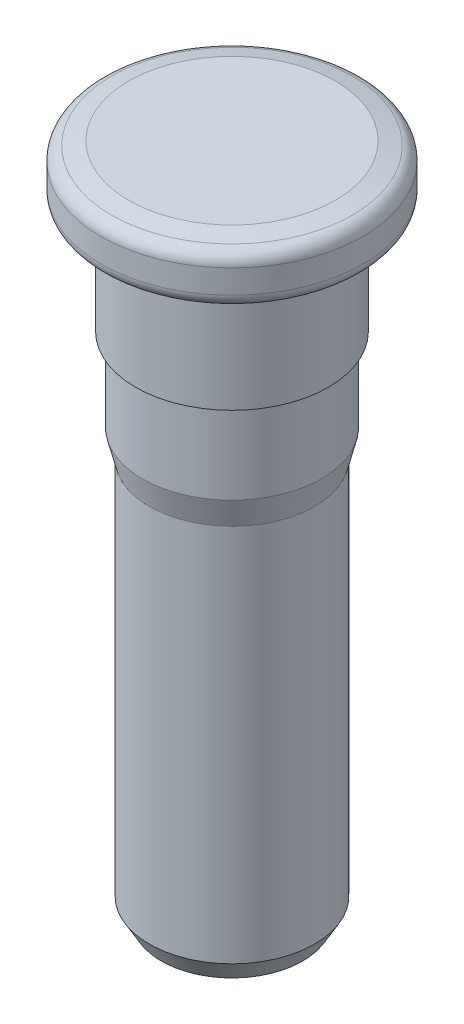
ISO-10303-21;
HEADER;
FILE_DESCRIPTION(('STEP AP214'),'2;1');
FILE_NAME('part.step','',(''),(''),'','','');
FILE_SCHEMA(('AUTOMOTIVE_DESIGN { 1 0 10303 214 1 1 1 1 }'));
ENDSEC;
DATA;
#1=APPLICATION_CONTEXT('core data for automotive mechanical design processes');
#2=APPLICATION_PROTOCOL_DEFINITION('international standard','automotive_design',2000,#1);
#3=PRODUCT_CONTEXT('',#1,'mechanical');
#4=PRODUCT('Part','Part','',(#3));
#5=PRODUCT_RELATED_PRODUCT_CATEGORY('part','',(#4));
#6=PRODUCT_DEFINITION_FORMATION('','',#4);
#7=PRODUCT_DEFINITION_CONTEXT('part definition',#1,'design');
#8=PRODUCT_DEFINITION('design','',#6,#7);
#9=PRODUCT_DEFINITION_SHAPE('','',#8);
#10=(LENGTH_UNIT() NAMED_UNIT(*) SI_UNIT(.MILLI.,.METRE.));
#11=(NAMED_UNIT(*) PLANE_ANGLE_UNIT() SI_UNIT($,.RADIAN.));
#12=(NAMED_UNIT(*) SI_UNIT($,.STERADIAN.) SOLID_ANGLE_UNIT());
#13=UNCERTAINTY_MEASURE_WITH_UNIT(LENGTH_MEASURE(1.E-05),#10,'distance_accuracy_value','');
#14=(GEOMETRIC_REPRESENTATION_CONTEXT(3) GLOBAL_UNCERTAINTY_ASSIGNED_CONTEXT((#13)) GLOBAL_UNIT_ASSIGNED_CONTEXT((#10,
#11,#12)) REPRESENTATION_CONTEXT('',''));
#15=CARTESIAN_POINT('',(0.,0.,0.));
#16=DIRECTION('',(0.,0.,1.));
#17=DIRECTION('',(1.,0.,0.));
#18=AXIS2_PLACEMENT_3D('',#15,#16,#17);
#19=CARTESIAN_POINT('',(0.,44.3370297371885,0.));
#20=DIRECTION('',(0.,1.,0.));
#21=DIRECTION('',(0.,0.,1.));
#22=AXIS2_PLACEMENT_3D('',#19,#20,#21);
#23=PLANE('',#22);
#24=CARTESIAN_POINT('',(0.,44.3370297371885,0.));
#25=DIRECTION('',(0.,-1.,0.));
#26=DIRECTION('',(0.,0.,-1.));
#27=AXIS2_PLACEMENT_3D('',#24,#25,#26);
#28=CIRCLE('',#27,7.5);
#29=CARTESIAN_POINT('',(0.,44.3370297371885,-7.5));
#30=VERTEX_POINT('',#29);
#31=EDGE_CURVE('E56',#30,#30,#28,.T.);
#32=ORIENTED_EDGE('',*,*,#31,.F.);
#33=EDGE_LOOP('',(#32));
#34=FACE_BOUND('',#33,.T.);
#35=ADVANCED_FACE('F30',(#34),#23,.T.);
#36=CARTESIAN_POINT('',(0.,43.8370297371885,0.));
#37=DIRECTION('',(0.,-1.,0.));
#38=DIRECTION('',(0.,0.,-1.));
#39=AXIS2_PLACEMENT_3D('',#36,#37,#38);
#40=CONICAL_SURFACE('',#39,9.5,1.32581766366803);
#41=CARTESIAN_POINT('',(0.,44.0263958309294,0.));
#42=DIRECTION('',(0.,1.,0.));
#43=DIRECTION('',(0.,0.,1.));
#44=AXIS2_PLACEMENT_3D('',#41,#42,#43);
#45=CIRCLE('',#44,8.74253562503634);
#46=CARTESIAN_POINT('',(0.,44.0263958309294,8.74253562503634));
#47=VERTEX_POINT('',#46);
#48=EDGE_CURVE('E50',#47,#47,#45,.T.);
#49=ORIENTED_EDGE('',*,*,#48,.T.);
#50=EDGE_LOOP('',(#49));
#51=FACE_BOUND('',#50,.T.);
#52=ORIENTED_EDGE('',*,*,#31,.T.);
#53=EDGE_LOOP('',(#52));
#54=FACE_BOUND('',#53,.T.);
#55=ADVANCED_FACE('F92',(#51,#54),#40,.T.);
#56=CARTESIAN_POINT('',(0.,-66.8261904761905,0.));
#57=DIRECTION('',(0.,-1.,0.));
#58=DIRECTION('',(0.,0.,-1.));
#59=AXIS2_PLACEMENT_3D('',#56,#57,#58);
#60=CYLINDRICAL_SURFACE('',#59,9.5);
#61=CARTESIAN_POINT('',(0.,41.3370297371885,0.));
#62=DIRECTION('',(0.,-1.,0.));
#63=DIRECTION('',(0.,0.,-1.));
#64=AXIS2_PLACEMENT_3D('',#61,#62,#63);
#65=CIRCLE('',#64,9.5);
#66=CARTESIAN_POINT('',(0.,41.3370297371885,-9.5));
#67=VERTEX_POINT('',#66);
#68=EDGE_CURVE('E41',#67,#67,#65,.F.);
#69=ORIENTED_EDGE('',*,*,#68,.T.);
#70=EDGE_LOOP('',(#69));
#71=FACE_BOUND('',#70,.T.);
#72=CARTESIAN_POINT('',(0.,43.0562533307841,0.));
#73=DIRECTION('',(0.,1.,0.));
#74=DIRECTION('',(0.,0.,1.));
#75=AXIS2_PLACEMENT_3D('',#72,#73,#74);
#76=CIRCLE('',#75,9.5);
#77=CARTESIAN_POINT('',(0.,43.0562533307841,9.5));
#78=VERTEX_POINT('',#77);
#79=EDGE_CURVE('E53',#78,#78,#76,.F.);
#80=ORIENTED_EDGE('',*,*,#79,.T.);
#81=EDGE_LOOP('',(#80));
#82=FACE_BOUND('',#81,.T.);
#83=ADVANCED_FACE('F98',(#71,#82),#60,.T.);
#84=CARTESIAN_POINT('',(9.5,40.3370297371885,0.));
#85=DIRECTION('',(0.,-1.,0.));
#86=DIRECTION('',(0.,0.,-1.));
#87=AXIS2_PLACEMENT_3D('',#84,#85,#86);
#88=PLANE('',#87);
#89=CARTESIAN_POINT('',(0.,40.3370297371885,0.));
#90=DIRECTION('',(0.,-1.,0.));
#91=DIRECTION('',(0.,0.,-1.));
#92=AXIS2_PLACEMENT_3D('',#89,#90,#91);
#93=CIRCLE('',#92,8.5);
#94=CARTESIAN_POINT('',(0.,40.3370297371885,-8.5));
#95=VERTEX_POINT('',#94);
#96=EDGE_CURVE('E45',#95,#95,#93,.T.);
#97=ORIENTED_EDGE('',*,*,#96,.T.);
#98=EDGE_LOOP('',(#97));
#99=FACE_BOUND('',#98,.T.);
#100=CARTESIAN_POINT('',(0.,40.3370297371885,0.));
#101=DIRECTION('',(0.,-1.,0.));
#102=DIRECTION('',(0.,0.,-1.));
#103=AXIS2_PLACEMENT_3D('',#100,#101,#102);
#104=CIRCLE('',#103,7.);
#105=CARTESIAN_POINT('',(0.,40.3370297371885,-7.));
#106=VERTEX_POINT('',#105);
#107=EDGE_CURVE('E59',#106,#106,#104,.T.);
#108=ORIENTED_EDGE('',*,*,#107,.F.);
#109=EDGE_LOOP('',(#108));
#110=FACE_BOUND('',#109,.T.);
#111=ADVANCED_FACE('F118',(#99,#110),#88,.T.);
#112=CARTESIAN_POINT('',(0.,-66.8261904761905,0.));
#113=DIRECTION('',(0.,-1.,0.));
#114=DIRECTION('',(0.,0.,-1.));
#115=AXIS2_PLACEMENT_3D('',#112,#113,#114);
#116=CYLINDRICAL_SURFACE('',#115,7.);
#117=ORIENTED_EDGE('',*,*,#107,.T.);
#118=EDGE_LOOP('',(#117));
#119=FACE_BOUND('',#118,.T.);
#120=CARTESIAN_POINT('',(0.,32.3370297371885,0.));
#121=DIRECTION('',(0.,-1.,0.));
#122=DIRECTION('',(0.,0.,-1.));
#123=AXIS2_PLACEMENT_3D('',#120,#121,#122);
#124=CIRCLE('',#123,7.);
#125=CARTESIAN_POINT('',(0.,32.3370297371885,-7.));
#126=VERTEX_POINT('',#125);
#127=EDGE_CURVE('E62',#126,#126,#124,.T.);
#128=ORIENTED_EDGE('',*,*,#127,.F.);
#129=EDGE_LOOP('',(#128));
#130=FACE_BOUND('',#129,.T.);
#131=ADVANCED_FACE('F121',(#119,#130),#116,.T.);
#132=CARTESIAN_POINT('',(7.,32.3370297371885,0.));
#133=DIRECTION('',(0.,-1.,0.));
#134=DIRECTION('',(0.,0.,-1.));
#135=AXIS2_PLACEMENT_3D('',#132,#133,#134);
#136=PLANE('',#135);
#137=ORIENTED_EDGE('',*,*,#127,.T.);
#138=EDGE_LOOP('',(#137));
#139=FACE_BOUND('',#138,.T.);
#140=CARTESIAN_POINT('',(0.,32.3370297371885,0.));
#141=DIRECTION('',(0.,-1.,0.));
#142=DIRECTION('',(0.,0.,-1.));
#143=AXIS2_PLACEMENT_3D('',#140,#141,#142);
#144=CIRCLE('',#143,6.5);
#145=CARTESIAN_POINT('',(0.,32.3370297371885,-6.5));
#146=VERTEX_POINT('',#145);
#147=EDGE_CURVE('E65',#146,#146,#144,.T.);
#148=ORIENTED_EDGE('',*,*,#147,.F.);
#149=EDGE_LOOP('',(#148));
#150=FACE_BOUND('',#149,.T.);
#151=ADVANCED_FACE('F88',(#139,#150),#136,.T.);
#152=CARTESIAN_POINT('',(0.,-66.8261904761905,0.));
#153=DIRECTION('',(0.,-1.,0.));
#154=DIRECTION('',(0.,0.,-1.));
#155=AXIS2_PLACEMENT_3D('',#152,#153,#154);
#156=CYLINDRICAL_SURFACE('',#155,6.5);
#157=ORIENTED_EDGE('',*,*,#147,.T.);
#158=EDGE_LOOP('',(#157));
#159=FACE_BOUND('',#158,.T.);
#160=CARTESIAN_POINT('',(0.,26.3370297371885,0.));
#161=DIRECTION('',(0.,-1.,0.));
#162=DIRECTION('',(0.,0.,-1.));
#163=AXIS2_PLACEMENT_3D('',#160,#161,#162);
#164=CIRCLE('',#163,6.5);
#165=CARTESIAN_POINT('',(0.,26.3370297371885,-6.5));
#166=VERTEX_POINT('',#165);
#167=EDGE_CURVE('E68',#166,#166,#164,.T.);
#168=ORIENTED_EDGE('',*,*,#167,.F.);
#169=EDGE_LOOP('',(#168));
#170=FACE_BOUND('',#169,.T.);
#171=ADVANCED_FACE('F79',(#159,#170),#156,.T.);
#172=CARTESIAN_POINT('',(0.,24.3370297371885,0.));
#173=DIRECTION('',(0.,1.,0.));
#174=DIRECTION('',(0.,0.,1.));
#175=AXIS2_PLACEMENT_3D('',#172,#173,#174);
#176=CONICAL_SURFACE('',#175,5.99999999999999,0.244978663126864);
#177=ORIENTED_EDGE('',*,*,#167,.T.);
#178=EDGE_LOOP('',(#177));
#179=FACE_BOUND('',#178,.T.);
#180=CARTESIAN_POINT('',(0.,24.3370297371885,0.));
#181=DIRECTION('',(0.,-1.,0.));
#182=DIRECTION('',(0.,0.,-1.));
#183=AXIS2_PLACEMENT_3D('',#180,#181,#182);
#184=CIRCLE('',#183,5.99999999999999);
#185=CARTESIAN_POINT('',(0.,24.3370297371885,-5.99999999999999));
#186=VERTEX_POINT('',#185);
#187=EDGE_CURVE('E71',#186,#186,#184,.T.);
#188=ORIENTED_EDGE('',*,*,#187,.F.);
#189=EDGE_LOOP('',(#188));
#190=FACE_BOUND('',#189,.T.);
#191=ADVANCED_FACE('F77',(#179,#190),#176,.T.);
#192=CARTESIAN_POINT('',(0.,-66.8261904761905,0.));
#193=DIRECTION('',(0.,-1.,0.));
#194=DIRECTION('',(0.,0.,-1.));
#195=AXIS2_PLACEMENT_3D('',#192,#193,#194);
#196=CYLINDRICAL_SURFACE('',#195,5.99999999999999);
#197=CARTESIAN_POINT('',(0.,-3.16297026281151,0.));
#198=DIRECTION('',(0.,-1.,0.));
#199=DIRECTION('',(0.,0.,-1.));
#200=AXIS2_PLACEMENT_3D('',#197,#198,#199);
#201=CIRCLE('',#200,5.99999999999999);
#202=CARTESIAN_POINT('',(0.,-3.16297026281151,-5.99999999999999));
#203=VERTEX_POINT('',#202);
#204=EDGE_CURVE('E10',#203,#203,#201,.F.);
#205=ORIENTED_EDGE('',*,*,#204,.T.);
#206=EDGE_LOOP('',(#205));
#207=FACE_BOUND('',#206,.T.);
#208=ORIENTED_EDGE('',*,*,#187,.T.);
#209=EDGE_LOOP('',(#208));
#210=FACE_BOUND('',#209,.T.);
#211=ADVANCED_FACE('F75',(#207,#210),#196,.T.);
#212=CARTESIAN_POINT('',(5.99999999999999,-4.66297026281151,0.));
#213=DIRECTION('',(0.,-1.,0.));
#214=DIRECTION('',(0.,0.,-1.));
#215=AXIS2_PLACEMENT_3D('',#212,#213,#214);
#216=PLANE('',#215);
#217=CARTESIAN_POINT('',(0.,-4.66297026281151,0.));
#218=DIRECTION('',(0.,-1.,0.));
#219=DIRECTION('',(0.,0.,-1.));
#220=AXIS2_PLACEMENT_3D('',#217,#218,#219);
#221=CIRCLE('',#220,5.13397459621555);
#222=CARTESIAN_POINT('',(0.,-4.66297026281151,-5.13397459621555));
#223=VERTEX_POINT('',#222);
#224=EDGE_CURVE('E37',#223,#223,#221,.T.);
#225=ORIENTED_EDGE('',*,*,#224,.T.);
#226=EDGE_LOOP('',(#225));
#227=FACE_BOUND('',#226,.T.);
#228=ADVANCED_FACE('F86',(#227),#216,.T.);
#229=CARTESIAN_POINT('',(0.,43.0562533307841,0.));
#230=DIRECTION('',(0.,1.,0.));
#231=DIRECTION('',(0.,0.,1.));
#232=AXIS2_PLACEMENT_3D('',#229,#230,#231);
#233=TOROIDAL_SURFACE('',#232,8.5,1.);
#234=ORIENTED_EDGE('',*,*,#48,.F.);
#235=EDGE_LOOP('',(#234));
#236=FACE_BOUND('',#235,.T.);
#237=ORIENTED_EDGE('',*,*,#79,.F.);
#238=EDGE_LOOP('',(#237));
#239=FACE_BOUND('',#238,.T.);
#240=ADVANCED_FACE('F104',(#236,#239),#233,.T.);
#241=CARTESIAN_POINT('',(0.,41.3370297371885,0.));
#242=DIRECTION('',(0.,-1.,0.));
#243=DIRECTION('',(0.,0.,-1.));
#244=AXIS2_PLACEMENT_3D('',#241,#242,#243);
#245=TOROIDAL_SURFACE('',#244,8.5,1.);
#246=ORIENTED_EDGE('',*,*,#68,.F.);
#247=EDGE_LOOP('',(#246));
#248=FACE_BOUND('',#247,.T.);
#249=ORIENTED_EDGE('',*,*,#96,.F.);
#250=EDGE_LOOP('',(#249));
#251=FACE_BOUND('',#250,.T.);
#252=ADVANCED_FACE('F106',(#248,#251),#245,.T.);
#253=CARTESIAN_POINT('',(0.,-4.66297026281151,0.));
#254=DIRECTION('',(0.,1.,0.));
#255=DIRECTION('',(0.,0.,1.));
#256=AXIS2_PLACEMENT_3D('',#253,#254,#255);
#257=CONICAL_SURFACE('',#256,5.13397459621555,0.523598775598301);
#258=ORIENTED_EDGE('',*,*,#204,.F.);
#259=EDGE_LOOP('',(#258));
#260=FACE_BOUND('',#259,.T.);
#261=ORIENTED_EDGE('',*,*,#224,.F.);
#262=EDGE_LOOP('',(#261));
#263=FACE_BOUND('',#262,.T.);
#264=ADVANCED_FACE('F32',(#260,#263),#257,.T.);
#265=CLOSED_SHELL('',(#35,#55,#83,#111,#131,#151,#171,#191,#211,#228,#240,#252,#264));
#266=MANIFOLD_SOLID_BREP('B2',#265);
#267=ADVANCED_BREP_SHAPE_REPRESENTATION('',(#18,#266),#14);
#268=SHAPE_DEFINITION_REPRESENTATION(#9,#267);
ENDSEC;
END-ISO-10303-21;
